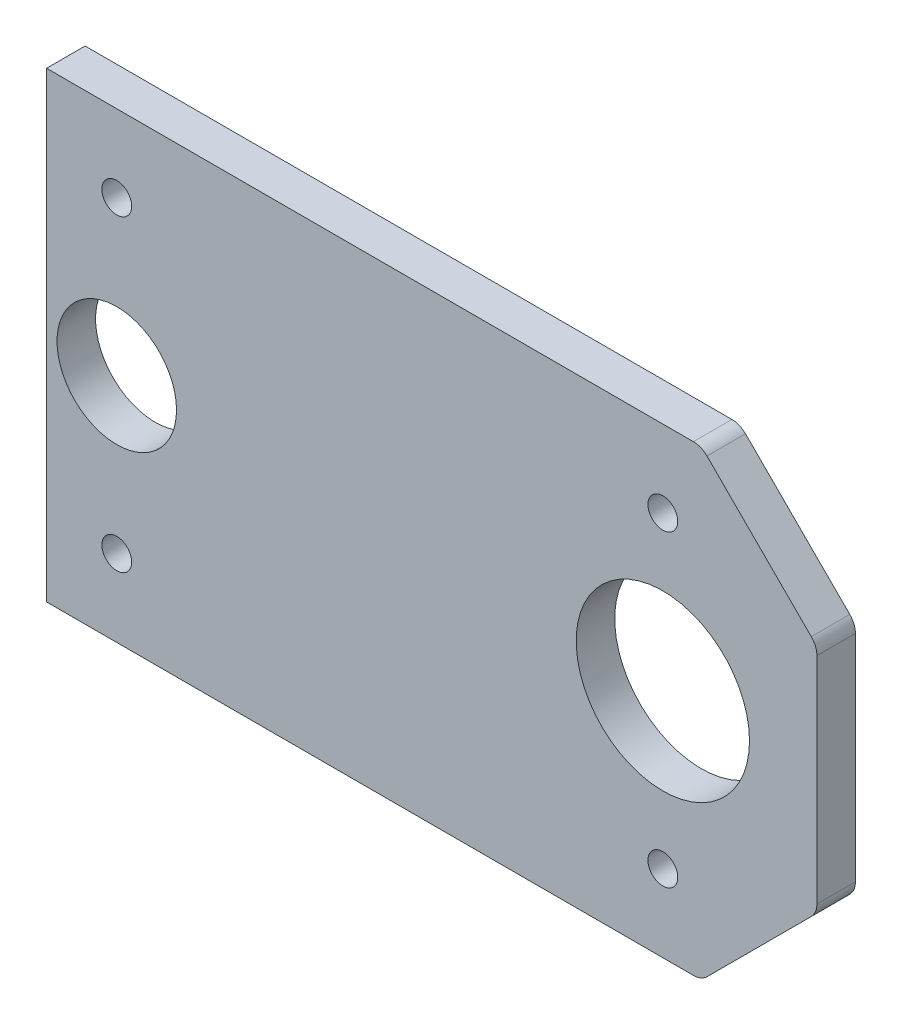
ISO-10303-21;
HEADER;
FILE_DESCRIPTION(('STEP AP214'),'2;1');
FILE_NAME('part.step','',(''),(''),'','','');
FILE_SCHEMA(('AUTOMOTIVE_DESIGN { 1 0 10303 214 1 1 1 1 }'));
ENDSEC;
DATA;
#1=APPLICATION_CONTEXT('core data for automotive mechanical design processes');
#2=APPLICATION_PROTOCOL_DEFINITION('international standard','automotive_design',2000,#1);
#3=PRODUCT_CONTEXT('',#1,'mechanical');
#4=PRODUCT('Part','Part','',(#3));
#5=PRODUCT_RELATED_PRODUCT_CATEGORY('part','',(#4));
#6=PRODUCT_DEFINITION_FORMATION('','',#4);
#7=PRODUCT_DEFINITION_CONTEXT('part definition',#1,'design');
#8=PRODUCT_DEFINITION('design','',#6,#7);
#9=PRODUCT_DEFINITION_SHAPE('','',#8);
#10=(LENGTH_UNIT() NAMED_UNIT(*) SI_UNIT(.MILLI.,.METRE.));
#11=(NAMED_UNIT(*) PLANE_ANGLE_UNIT() SI_UNIT($,.RADIAN.));
#12=(NAMED_UNIT(*) SI_UNIT($,.STERADIAN.) SOLID_ANGLE_UNIT());
#13=UNCERTAINTY_MEASURE_WITH_UNIT(LENGTH_MEASURE(1.E-05),#10,'distance_accuracy_value','');
#14=(GEOMETRIC_REPRESENTATION_CONTEXT(3) GLOBAL_UNCERTAINTY_ASSIGNED_CONTEXT((#13)) GLOBAL_UNIT_ASSIGNED_CONTEXT((#10,
#11,#12)) REPRESENTATION_CONTEXT('',''));
#15=CARTESIAN_POINT('',(0.,0.,0.));
#16=DIRECTION('',(0.,0.,1.));
#17=DIRECTION('',(1.,0.,0.));
#18=AXIS2_PLACEMENT_3D('',#15,#16,#17);
#19=CARTESIAN_POINT('',(63.5,38.1,3.175));
#20=DIRECTION('',(-1.,0.,0.));
#21=DIRECTION('',(0.,-1.,0.));
#22=AXIS2_PLACEMENT_3D('',#19,#20,#21);
#23=PLANE('',#22);
#24=DIRECTION('',(0.,1.,0.));
#25=VECTOR('',#24,1.);
#26=CARTESIAN_POINT('',(63.5,38.1,3.175));
#27=LINE('',#26,#25);
#28=CARTESIAN_POINT('',(63.5,-17.7348719394654,3.175));
#29=VERTEX_POINT('',#28);
#30=CARTESIAN_POINT('',(63.5,17.7348719394654,3.175));
#31=VERTEX_POINT('',#30);
#32=EDGE_CURVE('E123',#29,#31,#27,.T.);
#33=ORIENTED_EDGE('',*,*,#32,.F.);
#34=DIRECTION('',(0.,0.,1.));
#35=VECTOR('',#34,1.);
#36=CARTESIAN_POINT('',(63.5,-17.7348719394654,-3.175));
#37=LINE('',#36,#35);
#38=CARTESIAN_POINT('',(63.5,-17.7348719394654,-3.175));
#39=VERTEX_POINT('',#38);
#40=EDGE_CURVE('E185',#29,#39,#37,.F.);
#41=ORIENTED_EDGE('',*,*,#40,.T.);
#42=DIRECTION('',(0.,1.,0.));
#43=VECTOR('',#42,1.);
#44=CARTESIAN_POINT('',(63.5,38.1,-3.175));
#45=LINE('',#44,#43);
#46=CARTESIAN_POINT('',(63.5,17.7348719394654,-3.175));
#47=VERTEX_POINT('',#46);
#48=EDGE_CURVE('E143',#39,#47,#45,.T.);
#49=ORIENTED_EDGE('',*,*,#48,.T.);
#50=DIRECTION('',(0.,0.,-1.));
#51=VECTOR('',#50,1.);
#52=CARTESIAN_POINT('',(63.5,17.7348719394654,3.175));
#53=LINE('',#52,#51);
#54=EDGE_CURVE('E182',#47,#31,#53,.F.);
#55=ORIENTED_EDGE('',*,*,#54,.T.);
#56=EDGE_LOOP('',(#33,#41,#49,#55));
#57=FACE_BOUND('',#56,.T.);
#58=ADVANCED_FACE('F32',(#57),#23,.F.);
#59=CARTESIAN_POINT('',(-63.5,38.1,3.175));
#60=DIRECTION('',(0.,-1.,0.));
#61=DIRECTION('',(0.,0.,-1.));
#62=AXIS2_PLACEMENT_3D('',#59,#60,#61);
#63=PLANE('',#62);
#64=DIRECTION('',(-1.,0.,0.));
#65=VECTOR('',#64,1.);
#66=CARTESIAN_POINT('',(-63.5,38.1,3.175));
#67=LINE('',#66,#65);
#68=CARTESIAN_POINT('',(43.1348719394654,38.1,3.175));
#69=VERTEX_POINT('',#68);
#70=CARTESIAN_POINT('',(-63.5,38.1,3.175));
#71=VERTEX_POINT('',#70);
#72=EDGE_CURVE('E111',#69,#71,#67,.T.);
#73=ORIENTED_EDGE('',*,*,#72,.F.);
#74=DIRECTION('',(0.,0.,1.));
#75=VECTOR('',#74,1.);
#76=CARTESIAN_POINT('',(43.1348719394654,38.1,-3.175));
#77=LINE('',#76,#75);
#78=CARTESIAN_POINT('',(43.1348719394654,38.1,-3.175));
#79=VERTEX_POINT('',#78);
#80=EDGE_CURVE('E11',#69,#79,#77,.F.);
#81=ORIENTED_EDGE('',*,*,#80,.T.);
#82=DIRECTION('',(-1.,0.,0.));
#83=VECTOR('',#82,1.);
#84=CARTESIAN_POINT('',(-63.5,38.1,-3.175));
#85=LINE('',#84,#83);
#86=CARTESIAN_POINT('',(-63.5,38.1,-3.175));
#87=VERTEX_POINT('',#86);
#88=EDGE_CURVE('E129',#79,#87,#85,.T.);
#89=ORIENTED_EDGE('',*,*,#88,.T.);
#90=DIRECTION('',(0.,0.,-1.));
#91=VECTOR('',#90,1.);
#92=CARTESIAN_POINT('',(-63.5,38.1,3.175));
#93=LINE('',#92,#91);
#94=EDGE_CURVE('E126',#71,#87,#93,.T.);
#95=ORIENTED_EDGE('',*,*,#94,.F.);
#96=EDGE_LOOP('',(#73,#81,#89,#95));
#97=FACE_BOUND('',#96,.T.);
#98=ADVANCED_FACE('F127',(#97),#63,.F.);
#99=CARTESIAN_POINT('',(-63.5,38.1,3.175));
#100=DIRECTION('',(1.,0.,0.));
#101=DIRECTION('',(0.,1.,0.));
#102=AXIS2_PLACEMENT_3D('',#99,#100,#101);
#103=PLANE('',#102);
#104=DIRECTION('',(0.,-1.,0.));
#105=VECTOR('',#104,1.);
#106=CARTESIAN_POINT('',(-63.5,38.1,-3.175));
#107=LINE('',#106,#105);
#108=CARTESIAN_POINT('',(-63.5,-38.1,-3.175));
#109=VERTEX_POINT('',#108);
#110=EDGE_CURVE('E147',#87,#109,#107,.T.);
#111=ORIENTED_EDGE('',*,*,#110,.T.);
#112=DIRECTION('',(0.,0.,-1.));
#113=VECTOR('',#112,1.);
#114=CARTESIAN_POINT('',(-63.5,-38.1,3.175));
#115=LINE('',#114,#113);
#116=CARTESIAN_POINT('',(-63.5,-38.1,3.175));
#117=VERTEX_POINT('',#116);
#118=EDGE_CURVE('E133',#117,#109,#115,.T.);
#119=ORIENTED_EDGE('',*,*,#118,.F.);
#120=DIRECTION('',(0.,-1.,0.));
#121=VECTOR('',#120,1.);
#122=CARTESIAN_POINT('',(-63.5,38.1,3.175));
#123=LINE('',#122,#121);
#124=EDGE_CURVE('E116',#71,#117,#123,.T.);
#125=ORIENTED_EDGE('',*,*,#124,.F.);
#126=ORIENTED_EDGE('',*,*,#94,.T.);
#127=EDGE_LOOP('',(#111,#119,#125,#126));
#128=FACE_BOUND('',#127,.T.);
#129=ADVANCED_FACE('F135',(#128),#103,.F.);
#130=CARTESIAN_POINT('',(-63.5,-38.1,3.175));
#131=DIRECTION('',(0.,1.,0.));
#132=DIRECTION('',(0.,0.,1.));
#133=AXIS2_PLACEMENT_3D('',#130,#131,#132);
#134=PLANE('',#133);
#135=DIRECTION('',(1.,0.,0.));
#136=VECTOR('',#135,1.);
#137=CARTESIAN_POINT('',(-63.5,-38.1,-3.175));
#138=LINE('',#137,#136);
#139=CARTESIAN_POINT('',(43.1348719394654,-38.1,-3.175));
#140=VERTEX_POINT('',#139);
#141=EDGE_CURVE('E149',#109,#140,#138,.T.);
#142=ORIENTED_EDGE('',*,*,#141,.T.);
#143=DIRECTION('',(0.,0.,-1.));
#144=VECTOR('',#143,1.);
#145=CARTESIAN_POINT('',(43.1348719394654,-38.1,3.175));
#146=LINE('',#145,#144);
#147=CARTESIAN_POINT('',(43.1348719394654,-38.1,3.175));
#148=VERTEX_POINT('',#147);
#149=EDGE_CURVE('E162',#140,#148,#146,.F.);
#150=ORIENTED_EDGE('',*,*,#149,.T.);
#151=DIRECTION('',(1.,0.,0.));
#152=VECTOR('',#151,1.);
#153=CARTESIAN_POINT('',(-63.5,-38.1,3.175));
#154=LINE('',#153,#152);
#155=EDGE_CURVE('E138',#117,#148,#154,.T.);
#156=ORIENTED_EDGE('',*,*,#155,.F.);
#157=ORIENTED_EDGE('',*,*,#118,.T.);
#158=EDGE_LOOP('',(#142,#150,#156,#157));
#159=FACE_BOUND('',#158,.T.);
#160=ADVANCED_FACE('F243',(#159),#134,.F.);
#161=CARTESIAN_POINT('',(0.,0.,3.175));
#162=DIRECTION('',(0.,0.,1.));
#163=DIRECTION('',(1.,0.,0.));
#164=AXIS2_PLACEMENT_3D('',#161,#162,#163);
#165=PLANE('',#164);
#166=CARTESIAN_POINT('',(-51.92522,25.4,3.175));
#167=DIRECTION('',(0.,0.,1.));
#168=DIRECTION('',(1.,0.,0.));
#169=AXIS2_PLACEMENT_3D('',#166,#167,#168);
#170=CIRCLE('',#169,2.45744999999999);
#171=CARTESIAN_POINT('',(-49.46777,25.4,3.175));
#172=VERTEX_POINT('',#171);
#173=EDGE_CURVE('E235',#172,#172,#170,.T.);
#174=ORIENTED_EDGE('',*,*,#173,.F.);
#175=EDGE_LOOP('',(#174));
#176=FACE_BOUND('',#175,.T.);
#177=CARTESIAN_POINT('',(-51.92522,-25.4,3.175));
#178=DIRECTION('',(0.,0.,1.));
#179=DIRECTION('',(1.,0.,0.));
#180=AXIS2_PLACEMENT_3D('',#177,#178,#179);
#181=CIRCLE('',#180,2.45744999999999);
#182=CARTESIAN_POINT('',(-49.46777,-25.4,3.175));
#183=VERTEX_POINT('',#182);
#184=EDGE_CURVE('E229',#183,#183,#181,.T.);
#185=ORIENTED_EDGE('',*,*,#184,.F.);
#186=EDGE_LOOP('',(#185));
#187=FACE_BOUND('',#186,.T.);
#188=CARTESIAN_POINT('',(38.1,25.4,3.175));
#189=DIRECTION('',(0.,0.,1.));
#190=DIRECTION('',(1.,0.,0.));
#191=AXIS2_PLACEMENT_3D('',#188,#189,#190);
#192=CIRCLE('',#191,2.45744999999999);
#193=CARTESIAN_POINT('',(40.55745,25.4,3.175));
#194=VERTEX_POINT('',#193);
#195=EDGE_CURVE('E223',#194,#194,#192,.T.);
#196=ORIENTED_EDGE('',*,*,#195,.F.);
#197=EDGE_LOOP('',(#196));
#198=FACE_BOUND('',#197,.T.);
#199=CARTESIAN_POINT('',(38.1,-25.4,3.175));
#200=DIRECTION('',(0.,0.,1.));
#201=DIRECTION('',(1.,0.,0.));
#202=AXIS2_PLACEMENT_3D('',#199,#200,#201);
#203=CIRCLE('',#202,2.45744999999999);
#204=CARTESIAN_POINT('',(40.55745,-25.4,3.175));
#205=VERTEX_POINT('',#204);
#206=EDGE_CURVE('E217',#205,#205,#203,.T.);
#207=ORIENTED_EDGE('',*,*,#206,.F.);
#208=EDGE_LOOP('',(#207));
#209=FACE_BOUND('',#208,.T.);
#210=CARTESIAN_POINT('',(38.1,0.,3.175));
#211=DIRECTION('',(0.,0.,1.));
#212=DIRECTION('',(1.,0.,0.));
#213=AXIS2_PLACEMENT_3D('',#210,#211,#212);
#214=CIRCLE('',#213,14.2875);
#215=CARTESIAN_POINT('',(52.3875,0.,3.175));
#216=VERTEX_POINT('',#215);
#217=EDGE_CURVE('E209',#216,#216,#214,.T.);
#218=ORIENTED_EDGE('',*,*,#217,.F.);
#219=EDGE_LOOP('',(#218));
#220=FACE_BOUND('',#219,.T.);
#221=CARTESIAN_POINT('',(-51.92522,0.,3.175));
#222=DIRECTION('',(0.,0.,1.));
#223=DIRECTION('',(1.,0.,0.));
#224=AXIS2_PLACEMENT_3D('',#221,#222,#223);
#225=CIRCLE('',#224,9.84885);
#226=CARTESIAN_POINT('',(-42.07637,0.,3.175));
#227=VERTEX_POINT('',#226);
#228=EDGE_CURVE('E203',#227,#227,#225,.T.);
#229=ORIENTED_EDGE('',*,*,#228,.F.);
#230=EDGE_LOOP('',(#229));
#231=FACE_BOUND('',#230,.T.);
#232=ORIENTED_EDGE('',*,*,#155,.T.);
#233=CARTESIAN_POINT('',(43.1348719394654,-34.925,3.175));
#234=DIRECTION('',(0.,0.,1.));
#235=DIRECTION('',(1.,0.,0.));
#236=AXIS2_PLACEMENT_3D('',#233,#234,#235);
#237=CIRCLE('',#236,3.175);
#238=CARTESIAN_POINT('',(45.3799359697327,-37.1700640302673,3.175));
#239=VERTEX_POINT('',#238);
#240=EDGE_CURVE('E170',#148,#239,#237,.T.);
#241=ORIENTED_EDGE('',*,*,#240,.T.);
#242=DIRECTION('',(-0.707106781186549,-0.707106781186546,0.));
#243=VECTOR('',#242,1.);
#244=CARTESIAN_POINT('',(41.2749999999999,-41.275,3.175));
#245=LINE('',#244,#243);
#246=CARTESIAN_POINT('',(62.5700640302673,-19.9799359697327,3.175));
#247=VERTEX_POINT('',#246);
#248=EDGE_CURVE('E157',#239,#247,#245,.F.);
#249=ORIENTED_EDGE('',*,*,#248,.T.);
#250=CARTESIAN_POINT('',(60.325,-17.7348719394654,3.175));
#251=DIRECTION('',(0.,0.,1.));
#252=DIRECTION('',(1.,0.,0.));
#253=AXIS2_PLACEMENT_3D('',#250,#251,#252);
#254=CIRCLE('',#253,3.175);
#255=EDGE_CURVE('E168',#247,#29,#254,.T.);
#256=ORIENTED_EDGE('',*,*,#255,.T.);
#257=ORIENTED_EDGE('',*,*,#32,.T.);
#258=CARTESIAN_POINT('',(60.325,17.7348719394654,3.175));
#259=DIRECTION('',(0.,0.,1.));
#260=DIRECTION('',(1.,0.,0.));
#261=AXIS2_PLACEMENT_3D('',#258,#259,#260);
#262=CIRCLE('',#261,3.175);
#263=CARTESIAN_POINT('',(62.5700640302673,19.9799359697327,3.175));
#264=VERTEX_POINT('',#263);
#265=EDGE_CURVE('E166',#31,#264,#262,.T.);
#266=ORIENTED_EDGE('',*,*,#265,.T.);
#267=DIRECTION('',(0.707106781186546,-0.707106781186549,0.));
#268=VECTOR('',#267,1.);
#269=CARTESIAN_POINT('',(41.2750000000001,41.2749999999999,3.175));
#270=LINE('',#269,#268);
#271=CARTESIAN_POINT('',(45.3799359697327,37.1700640302673,3.175));
#272=VERTEX_POINT('',#271);
#273=EDGE_CURVE('E160',#264,#272,#270,.F.);
#274=ORIENTED_EDGE('',*,*,#273,.T.);
#275=CARTESIAN_POINT('',(43.1348719394654,34.925,3.175));
#276=DIRECTION('',(0.,0.,1.));
#277=DIRECTION('',(1.,0.,0.));
#278=AXIS2_PLACEMENT_3D('',#275,#276,#277);
#279=CIRCLE('',#278,3.175);
#280=EDGE_CURVE('E120',#272,#69,#279,.T.);
#281=ORIENTED_EDGE('',*,*,#280,.T.);
#282=ORIENTED_EDGE('',*,*,#72,.T.);
#283=ORIENTED_EDGE('',*,*,#124,.T.);
#284=EDGE_LOOP('',(#232,#241,#249,#256,#257,#266,#274,#281,#282,#283));
#285=FACE_BOUND('',#284,.T.);
#286=ADVANCED_FACE('F114',(#176,#187,#198,#209,#220,#231,#285),#165,.T.);
#287=CARTESIAN_POINT('',(0.,0.,-3.175));
#288=DIRECTION('',(0.,0.,1.));
#289=DIRECTION('',(1.,0.,0.));
#290=AXIS2_PLACEMENT_3D('',#287,#288,#289);
#291=PLANE('',#290);
#292=CARTESIAN_POINT('',(-51.92522,25.4,-3.175));
#293=DIRECTION('',(0.,0.,1.));
#294=DIRECTION('',(1.,0.,0.));
#295=AXIS2_PLACEMENT_3D('',#292,#293,#294);
#296=CIRCLE('',#295,2.45745);
#297=CARTESIAN_POINT('',(-49.46777,25.4,-3.175));
#298=VERTEX_POINT('',#297);
#299=EDGE_CURVE('E232',#298,#298,#296,.T.);
#300=ORIENTED_EDGE('',*,*,#299,.T.);
#301=EDGE_LOOP('',(#300));
#302=FACE_BOUND('',#301,.T.);
#303=CARTESIAN_POINT('',(-51.92522,-25.4,-3.175));
#304=DIRECTION('',(0.,0.,1.));
#305=DIRECTION('',(1.,0.,0.));
#306=AXIS2_PLACEMENT_3D('',#303,#304,#305);
#307=CIRCLE('',#306,2.45745);
#308=CARTESIAN_POINT('',(-49.46777,-25.4,-3.175));
#309=VERTEX_POINT('',#308);
#310=EDGE_CURVE('E226',#309,#309,#307,.T.);
#311=ORIENTED_EDGE('',*,*,#310,.T.);
#312=EDGE_LOOP('',(#311));
#313=FACE_BOUND('',#312,.T.);
#314=CARTESIAN_POINT('',(38.1,25.4,-3.175));
#315=DIRECTION('',(0.,0.,1.));
#316=DIRECTION('',(1.,0.,0.));
#317=AXIS2_PLACEMENT_3D('',#314,#315,#316);
#318=CIRCLE('',#317,2.45745);
#319=CARTESIAN_POINT('',(40.55745,25.4,-3.175));
#320=VERTEX_POINT('',#319);
#321=EDGE_CURVE('E220',#320,#320,#318,.T.);
#322=ORIENTED_EDGE('',*,*,#321,.T.);
#323=EDGE_LOOP('',(#322));
#324=FACE_BOUND('',#323,.T.);
#325=CARTESIAN_POINT('',(38.1,-25.4,-3.175));
#326=DIRECTION('',(0.,0.,1.));
#327=DIRECTION('',(1.,0.,0.));
#328=AXIS2_PLACEMENT_3D('',#325,#326,#327);
#329=CIRCLE('',#328,2.45745);
#330=CARTESIAN_POINT('',(40.55745,-25.4,-3.175));
#331=VERTEX_POINT('',#330);
#332=EDGE_CURVE('E212',#331,#331,#329,.T.);
#333=ORIENTED_EDGE('',*,*,#332,.T.);
#334=EDGE_LOOP('',(#333));
#335=FACE_BOUND('',#334,.T.);
#336=CARTESIAN_POINT('',(38.1,0.,-3.175));
#337=DIRECTION('',(0.,0.,1.));
#338=DIRECTION('',(1.,0.,0.));
#339=AXIS2_PLACEMENT_3D('',#336,#337,#338);
#340=CIRCLE('',#339,14.2875);
#341=CARTESIAN_POINT('',(52.3875,0.,-3.175));
#342=VERTEX_POINT('',#341);
#343=EDGE_CURVE('E206',#342,#342,#340,.T.);
#344=ORIENTED_EDGE('',*,*,#343,.T.);
#345=EDGE_LOOP('',(#344));
#346=FACE_BOUND('',#345,.T.);
#347=CARTESIAN_POINT('',(-51.92522,0.,-3.175));
#348=DIRECTION('',(0.,0.,1.));
#349=DIRECTION('',(1.,0.,0.));
#350=AXIS2_PLACEMENT_3D('',#347,#348,#349);
#351=CIRCLE('',#350,9.84885);
#352=CARTESIAN_POINT('',(-42.07637,0.,-3.175));
#353=VERTEX_POINT('',#352);
#354=EDGE_CURVE('E145',#353,#353,#351,.T.);
#355=ORIENTED_EDGE('',*,*,#354,.T.);
#356=EDGE_LOOP('',(#355));
#357=FACE_BOUND('',#356,.T.);
#358=DIRECTION('',(0.707106781186549,0.707106781186546,0.));
#359=VECTOR('',#358,1.);
#360=CARTESIAN_POINT('',(63.5,-19.05,-3.175));
#361=LINE('',#360,#359);
#362=CARTESIAN_POINT('',(62.5700640302673,-19.9799359697327,-3.175));
#363=VERTEX_POINT('',#362);
#364=CARTESIAN_POINT('',(45.3799359697327,-37.1700640302673,-3.175));
#365=VERTEX_POINT('',#364);
#366=EDGE_CURVE('E132',#363,#365,#361,.F.);
#367=ORIENTED_EDGE('',*,*,#366,.T.);
#368=CARTESIAN_POINT('',(43.1348719394654,-34.925,-3.175));
#369=DIRECTION('',(0.,0.,1.));
#370=DIRECTION('',(1.,0.,0.));
#371=AXIS2_PLACEMENT_3D('',#368,#369,#370);
#372=CIRCLE('',#371,3.175);
#373=EDGE_CURVE('E180',#365,#140,#372,.F.);
#374=ORIENTED_EDGE('',*,*,#373,.T.);
#375=ORIENTED_EDGE('',*,*,#141,.F.);
#376=ORIENTED_EDGE('',*,*,#110,.F.);
#377=ORIENTED_EDGE('',*,*,#88,.F.);
#378=CARTESIAN_POINT('',(43.1348719394654,34.925,-3.175));
#379=DIRECTION('',(0.,0.,1.));
#380=DIRECTION('',(1.,0.,0.));
#381=AXIS2_PLACEMENT_3D('',#378,#379,#380);
#382=CIRCLE('',#381,3.175);
#383=CARTESIAN_POINT('',(45.3799359697327,37.1700640302673,-3.175));
#384=VERTEX_POINT('',#383);
#385=EDGE_CURVE('E176',#79,#384,#382,.F.);
#386=ORIENTED_EDGE('',*,*,#385,.T.);
#387=DIRECTION('',(-0.707106781186546,0.707106781186549,0.));
#388=VECTOR('',#387,1.);
#389=CARTESIAN_POINT('',(44.45,38.1,-3.175));
#390=LINE('',#389,#388);
#391=CARTESIAN_POINT('',(62.5700640302673,19.9799359697327,-3.175));
#392=VERTEX_POINT('',#391);
#393=EDGE_CURVE('E155',#384,#392,#390,.F.);
#394=ORIENTED_EDGE('',*,*,#393,.T.);
#395=CARTESIAN_POINT('',(60.325,17.7348719394654,-3.175));
#396=DIRECTION('',(0.,0.,1.));
#397=DIRECTION('',(1.,0.,0.));
#398=AXIS2_PLACEMENT_3D('',#395,#396,#397);
#399=CIRCLE('',#398,3.175);
#400=EDGE_CURVE('E47',#392,#47,#399,.F.);
#401=ORIENTED_EDGE('',*,*,#400,.T.);
#402=ORIENTED_EDGE('',*,*,#48,.F.);
#403=CARTESIAN_POINT('',(60.325,-17.7348719394654,-3.175));
#404=DIRECTION('',(0.,0.,1.));
#405=DIRECTION('',(1.,0.,0.));
#406=AXIS2_PLACEMENT_3D('',#403,#404,#405);
#407=CIRCLE('',#406,3.175);
#408=EDGE_CURVE('E55',#39,#363,#407,.F.);
#409=ORIENTED_EDGE('',*,*,#408,.T.);
#410=EDGE_LOOP('',(#367,#374,#375,#376,#377,#386,#394,#401,#402,#409));
#411=FACE_BOUND('',#410,.T.);
#412=ADVANCED_FACE('F195',(#302,#313,#324,#335,#346,#357,#411),#291,.F.);
#413=CARTESIAN_POINT('',(-51.92522,0.,-3.175));
#414=DIRECTION('',(0.,0.,1.));
#415=DIRECTION('',(1.,0.,0.));
#416=AXIS2_PLACEMENT_3D('',#413,#414,#415);
#417=CYLINDRICAL_SURFACE('',#416,9.84885);
#418=ORIENTED_EDGE('',*,*,#354,.F.);
#419=EDGE_LOOP('',(#418));
#420=FACE_BOUND('',#419,.T.);
#421=ORIENTED_EDGE('',*,*,#228,.T.);
#422=EDGE_LOOP('',(#421));
#423=FACE_BOUND('',#422,.T.);
#424=ADVANCED_FACE('F255',(#420,#423),#417,.F.);
#425=CARTESIAN_POINT('',(38.1,0.,-3.175));
#426=DIRECTION('',(0.,0.,1.));
#427=DIRECTION('',(1.,0.,0.));
#428=AXIS2_PLACEMENT_3D('',#425,#426,#427);
#429=CYLINDRICAL_SURFACE('',#428,14.2875);
#430=ORIENTED_EDGE('',*,*,#343,.F.);
#431=EDGE_LOOP('',(#430));
#432=FACE_BOUND('',#431,.T.);
#433=ORIENTED_EDGE('',*,*,#217,.T.);
#434=EDGE_LOOP('',(#433));
#435=FACE_BOUND('',#434,.T.);
#436=ADVANCED_FACE('F257',(#432,#435),#429,.F.);
#437=CARTESIAN_POINT('',(44.45,38.1,3.175));
#438=DIRECTION('',(-0.707106781186549,-0.707106781186546,0.));
#439=DIRECTION('',(0.,0.,-1.));
#440=AXIS2_PLACEMENT_3D('',#437,#438,#439);
#441=PLANE('',#440);
#442=ORIENTED_EDGE('',*,*,#273,.F.);
#443=DIRECTION('',(0.,0.,1.));
#444=VECTOR('',#443,1.);
#445=CARTESIAN_POINT('',(62.5700640302673,19.9799359697327,-3.175));
#446=LINE('',#445,#444);
#447=EDGE_CURVE('E40',#264,#392,#446,.F.);
#448=ORIENTED_EDGE('',*,*,#447,.T.);
#449=ORIENTED_EDGE('',*,*,#393,.F.);
#450=DIRECTION('',(0.,0.,-1.));
#451=VECTOR('',#450,1.);
#452=CARTESIAN_POINT('',(45.3799359697327,37.1700640302673,3.175));
#453=LINE('',#452,#451);
#454=EDGE_CURVE('E187',#384,#272,#453,.F.);
#455=ORIENTED_EDGE('',*,*,#454,.T.);
#456=EDGE_LOOP('',(#442,#448,#449,#455));
#457=FACE_BOUND('',#456,.T.);
#458=ADVANCED_FACE('F192',(#457),#441,.F.);
#459=CARTESIAN_POINT('',(63.5,-19.05,3.175));
#460=DIRECTION('',(-0.707106781186546,0.707106781186549,0.));
#461=DIRECTION('',(0.,0.,-1.));
#462=AXIS2_PLACEMENT_3D('',#459,#460,#461);
#463=PLANE('',#462);
#464=ORIENTED_EDGE('',*,*,#248,.F.);
#465=DIRECTION('',(0.,0.,1.));
#466=VECTOR('',#465,1.);
#467=CARTESIAN_POINT('',(45.3799359697327,-37.1700640302673,-3.175));
#468=LINE('',#467,#466);
#469=EDGE_CURVE('E174',#239,#365,#468,.F.);
#470=ORIENTED_EDGE('',*,*,#469,.T.);
#471=ORIENTED_EDGE('',*,*,#366,.F.);
#472=DIRECTION('',(0.,0.,-1.));
#473=VECTOR('',#472,1.);
#474=CARTESIAN_POINT('',(62.5700640302673,-19.9799359697327,3.175));
#475=LINE('',#474,#473);
#476=EDGE_CURVE('E172',#363,#247,#475,.F.);
#477=ORIENTED_EDGE('',*,*,#476,.T.);
#478=EDGE_LOOP('',(#464,#470,#471,#477));
#479=FACE_BOUND('',#478,.T.);
#480=ADVANCED_FACE('F279',(#479),#463,.F.);
#481=CARTESIAN_POINT('',(38.1,-25.4,3.175));
#482=DIRECTION('',(0.,0.,1.));
#483=DIRECTION('',(1.,0.,0.));
#484=AXIS2_PLACEMENT_3D('',#481,#482,#483);
#485=CYLINDRICAL_SURFACE('',#484,2.45744999999999);
#486=ORIENTED_EDGE('',*,*,#332,.F.);
#487=EDGE_LOOP('',(#486));
#488=FACE_BOUND('',#487,.T.);
#489=ORIENTED_EDGE('',*,*,#206,.T.);
#490=EDGE_LOOP('',(#489));
#491=FACE_BOUND('',#490,.T.);
#492=ADVANCED_FACE('F282',(#488,#491),#485,.F.);
#493=CARTESIAN_POINT('',(38.1,25.4,3.175));
#494=DIRECTION('',(0.,0.,1.));
#495=DIRECTION('',(1.,0.,0.));
#496=AXIS2_PLACEMENT_3D('',#493,#494,#495);
#497=CYLINDRICAL_SURFACE('',#496,2.45744999999999);
#498=ORIENTED_EDGE('',*,*,#321,.F.);
#499=EDGE_LOOP('',(#498));
#500=FACE_BOUND('',#499,.T.);
#501=ORIENTED_EDGE('',*,*,#195,.T.);
#502=EDGE_LOOP('',(#501));
#503=FACE_BOUND('',#502,.T.);
#504=ADVANCED_FACE('F385',(#500,#503),#497,.F.);
#505=CARTESIAN_POINT('',(-51.92522,-25.4,3.175));
#506=DIRECTION('',(0.,0.,1.));
#507=DIRECTION('',(1.,0.,0.));
#508=AXIS2_PLACEMENT_3D('',#505,#506,#507);
#509=CYLINDRICAL_SURFACE('',#508,2.45744999999999);
#510=ORIENTED_EDGE('',*,*,#310,.F.);
#511=EDGE_LOOP('',(#510));
#512=FACE_BOUND('',#511,.T.);
#513=ORIENTED_EDGE('',*,*,#184,.T.);
#514=EDGE_LOOP('',(#513));
#515=FACE_BOUND('',#514,.T.);
#516=ADVANCED_FACE('F378',(#512,#515),#509,.F.);
#517=CARTESIAN_POINT('',(-51.92522,25.4,3.175));
#518=DIRECTION('',(0.,0.,1.));
#519=DIRECTION('',(1.,0.,0.));
#520=AXIS2_PLACEMENT_3D('',#517,#518,#519);
#521=CYLINDRICAL_SURFACE('',#520,2.45744999999999);
#522=ORIENTED_EDGE('',*,*,#299,.F.);
#523=EDGE_LOOP('',(#522));
#524=FACE_BOUND('',#523,.T.);
#525=ORIENTED_EDGE('',*,*,#173,.T.);
#526=EDGE_LOOP('',(#525));
#527=FACE_BOUND('',#526,.T.);
#528=ADVANCED_FACE('F239',(#524,#527),#521,.F.);
#529=CARTESIAN_POINT('',(43.1348719394654,-34.925,3.175));
#530=DIRECTION('',(0.,0.,1.));
#531=DIRECTION('',(1.,0.,0.));
#532=AXIS2_PLACEMENT_3D('',#529,#530,#531);
#533=CYLINDRICAL_SURFACE('',#532,3.175);
#534=ORIENTED_EDGE('',*,*,#373,.F.);
#535=ORIENTED_EDGE('',*,*,#469,.F.);
#536=ORIENTED_EDGE('',*,*,#240,.F.);
#537=ORIENTED_EDGE('',*,*,#149,.F.);
#538=EDGE_LOOP('',(#534,#535,#536,#537));
#539=FACE_BOUND('',#538,.T.);
#540=ADVANCED_FACE('F284',(#539),#533,.T.);
#541=CARTESIAN_POINT('',(60.325,-17.7348719394654,3.175));
#542=DIRECTION('',(0.,0.,-1.));
#543=DIRECTION('',(-1.,0.,0.));
#544=AXIS2_PLACEMENT_3D('',#541,#542,#543);
#545=CYLINDRICAL_SURFACE('',#544,3.175);
#546=ORIENTED_EDGE('',*,*,#255,.F.);
#547=ORIENTED_EDGE('',*,*,#476,.F.);
#548=ORIENTED_EDGE('',*,*,#408,.F.);
#549=ORIENTED_EDGE('',*,*,#40,.F.);
#550=EDGE_LOOP('',(#546,#547,#548,#549));
#551=FACE_BOUND('',#550,.T.);
#552=ADVANCED_FACE('F287',(#551),#545,.T.);
#553=CARTESIAN_POINT('',(60.325,17.7348719394654,3.175));
#554=DIRECTION('',(0.,0.,1.));
#555=DIRECTION('',(1.,0.,0.));
#556=AXIS2_PLACEMENT_3D('',#553,#554,#555);
#557=CYLINDRICAL_SURFACE('',#556,3.175);
#558=ORIENTED_EDGE('',*,*,#400,.F.);
#559=ORIENTED_EDGE('',*,*,#447,.F.);
#560=ORIENTED_EDGE('',*,*,#265,.F.);
#561=ORIENTED_EDGE('',*,*,#54,.F.);
#562=EDGE_LOOP('',(#558,#559,#560,#561));
#563=FACE_BOUND('',#562,.T.);
#564=ADVANCED_FACE('F197',(#563),#557,.T.);
#565=CARTESIAN_POINT('',(43.1348719394654,34.925,3.175));
#566=DIRECTION('',(0.,0.,-1.));
#567=DIRECTION('',(-1.,0.,0.));
#568=AXIS2_PLACEMENT_3D('',#565,#566,#567);
#569=CYLINDRICAL_SURFACE('',#568,3.175);
#570=ORIENTED_EDGE('',*,*,#280,.F.);
#571=ORIENTED_EDGE('',*,*,#454,.F.);
#572=ORIENTED_EDGE('',*,*,#385,.F.);
#573=ORIENTED_EDGE('',*,*,#80,.F.);
#574=EDGE_LOOP('',(#570,#571,#572,#573));
#575=FACE_BOUND('',#574,.T.);
#576=ADVANCED_FACE('F34',(#575),#569,.T.);
#577=CLOSED_SHELL('',(#58,#98,#129,#160,#286,#412,#424,#436,#458,#480,#492,#504,#516,#528,#540,
#552,#564,#576));
#578=MANIFOLD_SOLID_BREP('B2',#577);
#579=ADVANCED_BREP_SHAPE_REPRESENTATION('',(#18,#578),#14);
#580=SHAPE_DEFINITION_REPRESENTATION(#9,#579);
ENDSEC;
END-ISO-10303-21;
